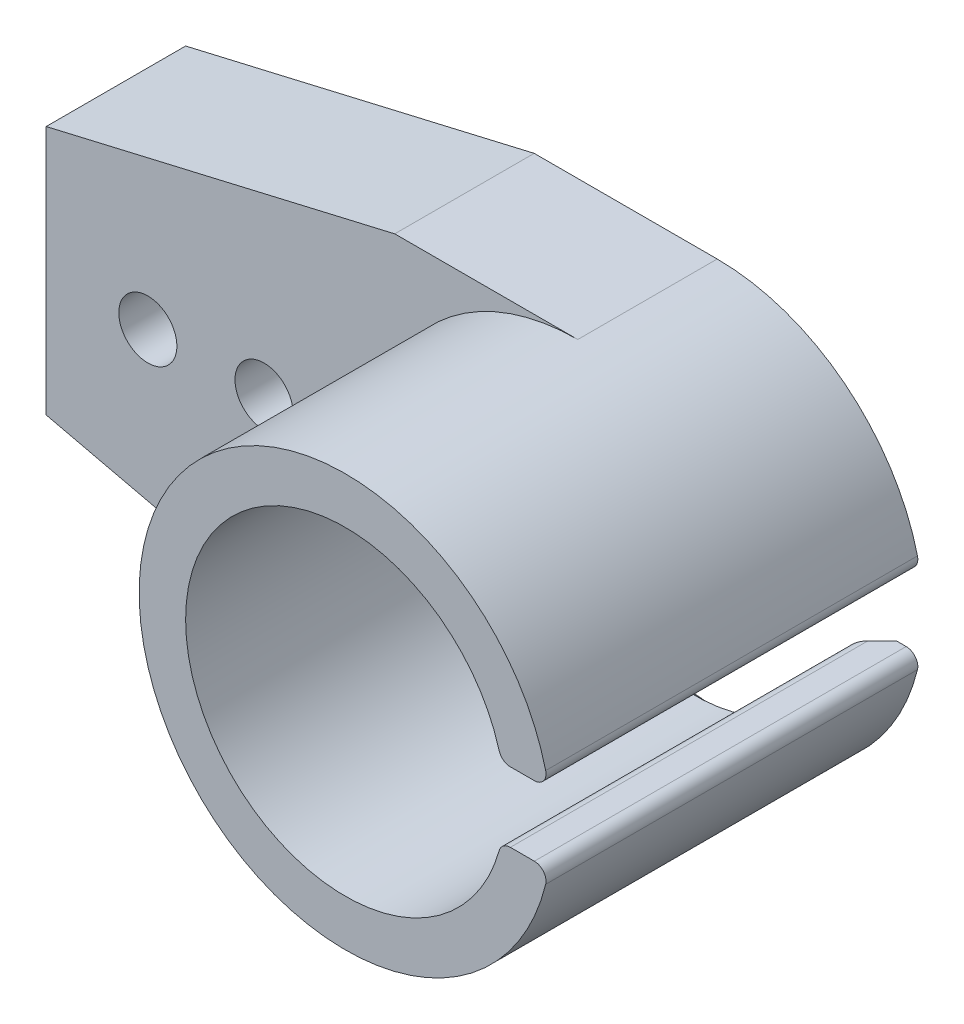
ISO-10303-21;
HEADER;
FILE_DESCRIPTION(('STEP AP214'),'2;1');
FILE_NAME('part.step','',(''),(''),'','','');
FILE_SCHEMA(('AUTOMOTIVE_DESIGN { 1 0 10303 214 1 1 1 1 }'));
ENDSEC;
DATA;
#1=APPLICATION_CONTEXT('core data for automotive mechanical design processes');
#2=APPLICATION_PROTOCOL_DEFINITION('international standard','automotive_design',2000,#1);
#3=PRODUCT_CONTEXT('',#1,'mechanical');
#4=PRODUCT('Part','Part','',(#3));
#5=PRODUCT_RELATED_PRODUCT_CATEGORY('part','',(#4));
#6=PRODUCT_DEFINITION_FORMATION('','',#4);
#7=PRODUCT_DEFINITION_CONTEXT('part definition',#1,'design');
#8=PRODUCT_DEFINITION('design','',#6,#7);
#9=PRODUCT_DEFINITION_SHAPE('','',#8);
#10=(LENGTH_UNIT() NAMED_UNIT(*) SI_UNIT(.MILLI.,.METRE.));
#11=(NAMED_UNIT(*) PLANE_ANGLE_UNIT() SI_UNIT($,.RADIAN.));
#12=(NAMED_UNIT(*) SI_UNIT($,.STERADIAN.) SOLID_ANGLE_UNIT());
#13=UNCERTAINTY_MEASURE_WITH_UNIT(LENGTH_MEASURE(1.E-05),#10,'distance_accuracy_value','');
#14=(GEOMETRIC_REPRESENTATION_CONTEXT(3) GLOBAL_UNCERTAINTY_ASSIGNED_CONTEXT((#13)) GLOBAL_UNIT_ASSIGNED_CONTEXT((#10,
#11,#12)) REPRESENTATION_CONTEXT('',''));
#15=CARTESIAN_POINT('',(0.,0.,0.));
#16=DIRECTION('',(0.,0.,1.));
#17=DIRECTION('',(1.,0.,0.));
#18=AXIS2_PLACEMENT_3D('',#15,#16,#17);
#19=CARTESIAN_POINT('',(-37.,0.,32.));
#20=DIRECTION('',(0.,0.,-1.));
#21=DIRECTION('',(-1.,0.,0.));
#22=AXIS2_PLACEMENT_3D('',#19,#20,#21);
#23=CYLINDRICAL_SURFACE('',#22,2.5);
#24=CARTESIAN_POINT('',(-37.,0.,2.));
#25=DIRECTION('',(0.,0.,-1.));
#26=DIRECTION('',(-1.,0.,0.));
#27=AXIS2_PLACEMENT_3D('',#24,#25,#26);
#28=CIRCLE('',#27,2.5);
#29=CARTESIAN_POINT('',(-39.5,0.,2.));
#30=VERTEX_POINT('',#29);
#31=EDGE_CURVE('E354',#30,#30,#28,.T.);
#32=ORIENTED_EDGE('',*,*,#31,.T.);
#33=EDGE_LOOP('',(#32));
#34=FACE_BOUND('',#33,.T.);
#35=CARTESIAN_POINT('',(-37.,0.,12.));
#36=DIRECTION('',(0.,0.,1.));
#37=DIRECTION('',(1.,0.,0.));
#38=AXIS2_PLACEMENT_3D('',#35,#36,#37);
#39=CIRCLE('',#38,2.5);
#40=CARTESIAN_POINT('',(-34.5,0.,12.));
#41=VERTEX_POINT('',#40);
#42=EDGE_CURVE('E394',#41,#41,#39,.T.);
#43=ORIENTED_EDGE('',*,*,#42,.T.);
#44=EDGE_LOOP('',(#43));
#45=FACE_BOUND('',#44,.T.);
#46=ADVANCED_FACE('F39',(#34,#45),#23,.F.);
#47=CARTESIAN_POINT('',(-27.,0.,32.));
#48=DIRECTION('',(0.,0.,-1.));
#49=DIRECTION('',(-1.,0.,0.));
#50=AXIS2_PLACEMENT_3D('',#47,#48,#49);
#51=CYLINDRICAL_SURFACE('',#50,2.5);
#52=CARTESIAN_POINT('',(-27.,0.,2.));
#53=DIRECTION('',(0.,0.,-1.));
#54=DIRECTION('',(-1.,0.,0.));
#55=AXIS2_PLACEMENT_3D('',#52,#53,#54);
#56=CIRCLE('',#55,2.5);
#57=CARTESIAN_POINT('',(-29.5,0.,2.));
#58=VERTEX_POINT('',#57);
#59=EDGE_CURVE('E44',#58,#58,#56,.T.);
#60=ORIENTED_EDGE('',*,*,#59,.T.);
#61=EDGE_LOOP('',(#60));
#62=FACE_BOUND('',#61,.T.);
#63=CARTESIAN_POINT('',(-27.,0.,12.));
#64=DIRECTION('',(0.,0.,1.));
#65=DIRECTION('',(1.,0.,0.));
#66=AXIS2_PLACEMENT_3D('',#63,#64,#65);
#67=CIRCLE('',#66,2.5);
#68=CARTESIAN_POINT('',(-24.5,0.,12.));
#69=VERTEX_POINT('',#68);
#70=EDGE_CURVE('E406',#69,#69,#67,.T.);
#71=ORIENTED_EDGE('',*,*,#70,.T.);
#72=EDGE_LOOP('',(#71));
#73=FACE_BOUND('',#72,.T.);
#74=ADVANCED_FACE('F251',(#62,#73),#51,.F.);
#75=CARTESIAN_POINT('',(-45.75,17.75,32.));
#76=DIRECTION('',(0.,-1.,0.));
#77=DIRECTION('',(0.,0.,-1.));
#78=AXIS2_PLACEMENT_3D('',#75,#76,#77);
#79=PLANE('',#78);
#80=DIRECTION('',(-1.,0.,0.));
#81=VECTOR('',#80,1.);
#82=CARTESIAN_POINT('',(-45.75,17.75,0.));
#83=LINE('',#82,#81);
#84=CARTESIAN_POINT('',(0.,17.75,0.));
#85=VERTEX_POINT('',#84);
#86=CARTESIAN_POINT('',(-15.75,17.75,0.));
#87=VERTEX_POINT('',#86);
#88=EDGE_CURVE('E200',#85,#87,#83,.T.);
#89=ORIENTED_EDGE('',*,*,#88,.T.);
#90=DIRECTION('',(0.,0.,1.));
#91=VECTOR('',#90,1.);
#92=CARTESIAN_POINT('',(-15.75,17.75,0.));
#93=LINE('',#92,#91);
#94=CARTESIAN_POINT('',(-15.75,17.75,12.));
#95=VERTEX_POINT('',#94);
#96=EDGE_CURVE('E172',#87,#95,#93,.T.);
#97=ORIENTED_EDGE('',*,*,#96,.T.);
#98=DIRECTION('',(-1.,0.,0.));
#99=VECTOR('',#98,1.);
#100=CARTESIAN_POINT('',(0.,17.75,12.));
#101=LINE('',#100,#99);
#102=CARTESIAN_POINT('',(0.,17.75,12.));
#103=VERTEX_POINT('',#102);
#104=EDGE_CURVE('E412',#103,#95,#101,.T.);
#105=ORIENTED_EDGE('',*,*,#104,.F.);
#106=DIRECTION('',(0.,0.,-1.));
#107=VECTOR('',#106,1.);
#108=CARTESIAN_POINT('',(0.,17.75,32.));
#109=LINE('',#108,#107);
#110=EDGE_CURVE('E212',#103,#85,#109,.T.);
#111=ORIENTED_EDGE('',*,*,#110,.T.);
#112=EDGE_LOOP('',(#89,#97,#105,#111));
#113=FACE_BOUND('',#112,.T.);
#114=ADVANCED_FACE('F240',(#113),#79,.F.);
#115=CARTESIAN_POINT('',(-45.75,-17.75,32.));
#116=DIRECTION('',(1.,0.,0.));
#117=DIRECTION('',(0.,0.,-1.));
#118=AXIS2_PLACEMENT_3D('',#115,#116,#117);
#119=PLANE('',#118);
#120=DIRECTION('',(0.,-1.,0.));
#121=VECTOR('',#120,1.);
#122=CARTESIAN_POINT('',(-45.75,17.75,12.));
#123=LINE('',#122,#121);
#124=CARTESIAN_POINT('',(-45.75,10.75,12.));
#125=VERTEX_POINT('',#124);
#126=CARTESIAN_POINT('',(-45.75,-10.75,12.));
#127=VERTEX_POINT('',#126);
#128=EDGE_CURVE('E187',#125,#127,#123,.T.);
#129=ORIENTED_EDGE('',*,*,#128,.F.);
#130=DIRECTION('',(0.,0.,1.));
#131=VECTOR('',#130,1.);
#132=CARTESIAN_POINT('',(-45.75,10.75,0.));
#133=LINE('',#132,#131);
#134=CARTESIAN_POINT('',(-45.75,10.75,0.));
#135=VERTEX_POINT('',#134);
#136=EDGE_CURVE('E64',#135,#125,#133,.T.);
#137=ORIENTED_EDGE('',*,*,#136,.F.);
#138=DIRECTION('',(0.,-1.,0.));
#139=VECTOR('',#138,1.);
#140=CARTESIAN_POINT('',(-45.75,-17.75,0.));
#141=LINE('',#140,#139);
#142=CARTESIAN_POINT('',(-45.75,10.1,0.));
#143=VERTEX_POINT('',#142);
#144=EDGE_CURVE('E183',#135,#143,#141,.T.);
#145=ORIENTED_EDGE('',*,*,#144,.T.);
#146=DIRECTION('',(0.,0.,-1.));
#147=VECTOR('',#146,1.);
#148=CARTESIAN_POINT('',(-45.75,10.1,2.));
#149=LINE('',#148,#147);
#150=CARTESIAN_POINT('',(-45.75,10.1,2.));
#151=VERTEX_POINT('',#150);
#152=EDGE_CURVE('E377',#151,#143,#149,.T.);
#153=ORIENTED_EDGE('',*,*,#152,.F.);
#154=DIRECTION('',(0.,1.,0.));
#155=VECTOR('',#154,1.);
#156=CARTESIAN_POINT('',(-45.75,-10.1,2.));
#157=LINE('',#156,#155);
#158=CARTESIAN_POINT('',(-45.75,-10.1,2.));
#159=VERTEX_POINT('',#158);
#160=EDGE_CURVE('E389',#159,#151,#157,.T.);
#161=ORIENTED_EDGE('',*,*,#160,.F.);
#162=DIRECTION('',(0.,0.,-1.));
#163=VECTOR('',#162,1.);
#164=CARTESIAN_POINT('',(-45.75,-10.1,2.));
#165=LINE('',#164,#163);
#166=CARTESIAN_POINT('',(-45.75,-10.1,0.));
#167=VERTEX_POINT('',#166);
#168=EDGE_CURVE('E384',#159,#167,#165,.T.);
#169=ORIENTED_EDGE('',*,*,#168,.T.);
#170=CARTESIAN_POINT('',(-45.75,-10.75,0.));
#171=VERTEX_POINT('',#170);
#172=EDGE_CURVE('E195',#167,#171,#141,.T.);
#173=ORIENTED_EDGE('',*,*,#172,.T.);
#174=DIRECTION('',(0.,0.,1.));
#175=VECTOR('',#174,1.);
#176=CARTESIAN_POINT('',(-45.75,-10.75,0.));
#177=LINE('',#176,#175);
#178=EDGE_CURVE('E421',#171,#127,#177,.T.);
#179=ORIENTED_EDGE('',*,*,#178,.T.);
#180=EDGE_LOOP('',(#129,#137,#145,#153,#161,#169,#173,#179));
#181=FACE_BOUND('',#180,.T.);
#182=ADVANCED_FACE('F181',(#181),#119,.F.);
#183=CARTESIAN_POINT('',(0.,-17.75,32.));
#184=DIRECTION('',(0.,1.,0.));
#185=DIRECTION('',(0.,0.,1.));
#186=AXIS2_PLACEMENT_3D('',#183,#184,#185);
#187=PLANE('',#186);
#188=DIRECTION('',(1.,0.,0.));
#189=VECTOR('',#188,1.);
#190=CARTESIAN_POINT('',(-45.75,-17.75,12.));
#191=LINE('',#190,#189);
#192=CARTESIAN_POINT('',(-15.75,-17.75,12.));
#193=VERTEX_POINT('',#192);
#194=CARTESIAN_POINT('',(0.,-17.75,12.));
#195=VERTEX_POINT('',#194);
#196=EDGE_CURVE('E409',#193,#195,#191,.T.);
#197=ORIENTED_EDGE('',*,*,#196,.F.);
#198=DIRECTION('',(0.,0.,1.));
#199=VECTOR('',#198,1.);
#200=CARTESIAN_POINT('',(-15.75,-17.75,0.));
#201=LINE('',#200,#199);
#202=CARTESIAN_POINT('',(-15.75,-17.75,0.));
#203=VERTEX_POINT('',#202);
#204=EDGE_CURVE('E56',#203,#193,#201,.T.);
#205=ORIENTED_EDGE('',*,*,#204,.F.);
#206=DIRECTION('',(1.,0.,0.));
#207=VECTOR('',#206,1.);
#208=CARTESIAN_POINT('',(0.,-17.75,0.));
#209=LINE('',#208,#207);
#210=CARTESIAN_POINT('',(0.,-17.75,0.));
#211=VERTEX_POINT('',#210);
#212=EDGE_CURVE('E194',#203,#211,#209,.T.);
#213=ORIENTED_EDGE('',*,*,#212,.T.);
#214=DIRECTION('',(0.,0.,-1.));
#215=VECTOR('',#214,1.);
#216=CARTESIAN_POINT('',(0.,-17.75,32.));
#217=LINE('',#216,#215);
#218=EDGE_CURVE('E209',#195,#211,#217,.T.);
#219=ORIENTED_EDGE('',*,*,#218,.F.);
#220=EDGE_LOOP('',(#197,#205,#213,#219));
#221=FACE_BOUND('',#220,.T.);
#222=ADVANCED_FACE('F264',(#221),#187,.F.);
#223=CARTESIAN_POINT('',(0.,0.,32.));
#224=DIRECTION('',(0.,0.,1.));
#225=DIRECTION('',(1.,0.,0.));
#226=AXIS2_PLACEMENT_3D('',#223,#224,#225);
#227=PLANE('',#226);
#228=CARTESIAN_POINT('',(16.2653773396131,4.,32.));
#229=DIRECTION('',(0.,0.,1.));
#230=DIRECTION('',(1.,0.,0.));
#231=AXIS2_PLACEMENT_3D('',#228,#229,#230);
#232=CIRCLE('',#231,1.);
#233=CARTESIAN_POINT('',(16.2653773396131,3.,32.));
#234=VERTEX_POINT('',#233);
#235=CARTESIAN_POINT('',(17.2364446434706,4.23880597014925,32.));
#236=VERTEX_POINT('',#235);
#237=EDGE_CURVE('E295',#234,#236,#232,.T.);
#238=ORIENTED_EDGE('',*,*,#237,.T.);
#239=CARTESIAN_POINT('',(0.,0.,32.));
#240=DIRECTION('',(0.,0.,1.));
#241=DIRECTION('',(-1.,0.,0.));
#242=AXIS2_PLACEMENT_3D('',#239,#240,#241);
#243=CIRCLE('',#242,17.75);
#244=CARTESIAN_POINT('',(17.2364446434706,-4.23880597014925,32.));
#245=VERTEX_POINT('',#244);
#246=EDGE_CURVE('E343',#236,#245,#243,.T.);
#247=ORIENTED_EDGE('',*,*,#246,.T.);
#248=CARTESIAN_POINT('',(16.2653773396131,-4.,32.));
#249=DIRECTION('',(0.,0.,1.));
#250=DIRECTION('',(1.,0.,0.));
#251=AXIS2_PLACEMENT_3D('',#248,#249,#250);
#252=CIRCLE('',#251,1.);
#253=CARTESIAN_POINT('',(16.2653773396131,-3.,32.));
#254=VERTEX_POINT('',#253);
#255=EDGE_CURVE('E298',#245,#254,#252,.T.);
#256=ORIENTED_EDGE('',*,*,#255,.T.);
#257=DIRECTION('',(-1.,0.,0.));
#258=VECTOR('',#257,1.);
#259=CARTESIAN_POINT('',(17.4946420369209,-3.,32.));
#260=LINE('',#259,#258);
#261=CARTESIAN_POINT('',(14.1972708645007,-3.,32.));
#262=VERTEX_POINT('',#261);
#263=EDGE_CURVE('E213',#254,#262,#260,.T.);
#264=ORIENTED_EDGE('',*,*,#263,.T.);
#265=CARTESIAN_POINT('',(14.1972708645007,-4.,32.));
#266=DIRECTION('',(0.,0.,1.));
#267=DIRECTION('',(1.,0.,0.));
#268=AXIS2_PLACEMENT_3D('',#265,#266,#267);
#269=CIRCLE('',#268,1.);
#270=CARTESIAN_POINT('',(13.2347440262295,-3.72881355932203,32.));
#271=VERTEX_POINT('',#270);
#272=EDGE_CURVE('E293',#262,#271,#269,.T.);
#273=ORIENTED_EDGE('',*,*,#272,.T.);
#274=CARTESIAN_POINT('',(0.,0.,32.));
#275=DIRECTION('',(0.,0.,-1.));
#276=DIRECTION('',(1.,0.,0.));
#277=AXIS2_PLACEMENT_3D('',#274,#275,#276);
#278=CIRCLE('',#277,13.75);
#279=CARTESIAN_POINT('',(13.2347440262295,3.72881355932203,32.));
#280=VERTEX_POINT('',#279);
#281=EDGE_CURVE('E208',#271,#280,#278,.T.);
#282=ORIENTED_EDGE('',*,*,#281,.T.);
#283=CARTESIAN_POINT('',(14.1972708645007,4.,32.));
#284=DIRECTION('',(0.,0.,1.));
#285=DIRECTION('',(1.,0.,0.));
#286=AXIS2_PLACEMENT_3D('',#283,#284,#285);
#287=CIRCLE('',#286,1.);
#288=CARTESIAN_POINT('',(14.1972708645007,3.,32.));
#289=VERTEX_POINT('',#288);
#290=EDGE_CURVE('E291',#280,#289,#287,.T.);
#291=ORIENTED_EDGE('',*,*,#290,.T.);
#292=DIRECTION('',(1.,0.,0.));
#293=VECTOR('',#292,1.);
#294=CARTESIAN_POINT('',(13.4187369003196,3.,32.));
#295=LINE('',#294,#293);
#296=EDGE_CURVE('E347',#289,#234,#295,.T.);
#297=ORIENTED_EDGE('',*,*,#296,.T.);
#298=EDGE_LOOP('',(#238,#247,#256,#264,#273,#282,#291,#297));
#299=FACE_BOUND('',#298,.T.);
#300=ADVANCED_FACE('F247',(#299),#227,.T.);
#301=CARTESIAN_POINT('',(0.,0.,0.));
#302=DIRECTION('',(0.,0.,1.));
#303=DIRECTION('',(1.,0.,0.));
#304=AXIS2_PLACEMENT_3D('',#301,#302,#303);
#305=PLANE('',#304);
#306=ORIENTED_EDGE('',*,*,#144,.F.);
#307=DIRECTION('',(0.973841209741793,0.227229615606419,0.));
#308=VECTOR('',#307,1.);
#309=CARTESIAN_POINT('',(-15.75,17.75,0.));
#310=LINE('',#309,#308);
#311=EDGE_CURVE('E169',#135,#87,#310,.T.);
#312=ORIENTED_EDGE('',*,*,#311,.T.);
#313=ORIENTED_EDGE('',*,*,#88,.F.);
#314=CARTESIAN_POINT('',(0.,0.,0.));
#315=DIRECTION('',(0.,0.,1.));
#316=DIRECTION('',(1.,0.,0.));
#317=AXIS2_PLACEMENT_3D('',#314,#315,#316);
#318=CIRCLE('',#317,17.75);
#319=CARTESIAN_POINT('',(17.2364446434706,4.23880597014925,0.));
#320=VERTEX_POINT('',#319);
#321=EDGE_CURVE('E353',#320,#85,#318,.T.);
#322=ORIENTED_EDGE('',*,*,#321,.F.);
#323=CARTESIAN_POINT('',(16.2653773396131,4.,0.));
#324=DIRECTION('',(0.,0.,1.));
#325=DIRECTION('',(1.,0.,0.));
#326=AXIS2_PLACEMENT_3D('',#323,#324,#325);
#327=CIRCLE('',#326,1.);
#328=CARTESIAN_POINT('',(16.2653773396131,3.,0.));
#329=VERTEX_POINT('',#328);
#330=EDGE_CURVE('E285',#320,#329,#327,.F.);
#331=ORIENTED_EDGE('',*,*,#330,.T.);
#332=DIRECTION('',(1.,0.,0.));
#333=VECTOR('',#332,1.);
#334=CARTESIAN_POINT('',(13.4187369003196,3.,0.));
#335=LINE('',#334,#333);
#336=CARTESIAN_POINT('',(15.4616460960662,3.,0.));
#337=VERTEX_POINT('',#336);
#338=EDGE_CURVE('E351',#337,#329,#335,.T.);
#339=ORIENTED_EDGE('',*,*,#338,.F.);
#340=CARTESIAN_POINT('',(0.,0.,0.));
#341=DIRECTION('',(0.,0.,1.));
#342=DIRECTION('',(1.,0.,0.));
#343=AXIS2_PLACEMENT_3D('',#340,#341,#342);
#344=CIRCLE('',#343,15.75);
#345=CARTESIAN_POINT('',(15.4616460960662,-3.,0.));
#346=VERTEX_POINT('',#345);
#347=EDGE_CURVE('E226',#337,#346,#344,.T.);
#348=ORIENTED_EDGE('',*,*,#347,.T.);
#349=DIRECTION('',(-1.,0.,0.));
#350=VECTOR('',#349,1.);
#351=CARTESIAN_POINT('',(17.4946420369209,-3.,0.));
#352=LINE('',#351,#350);
#353=CARTESIAN_POINT('',(16.2653773396131,-3.,0.));
#354=VERTEX_POINT('',#353);
#355=EDGE_CURVE('E206',#354,#346,#352,.T.);
#356=ORIENTED_EDGE('',*,*,#355,.F.);
#357=CARTESIAN_POINT('',(16.2653773396131,-4.,0.));
#358=DIRECTION('',(0.,0.,1.));
#359=DIRECTION('',(1.,0.,0.));
#360=AXIS2_PLACEMENT_3D('',#357,#358,#359);
#361=CIRCLE('',#360,1.);
#362=CARTESIAN_POINT('',(17.2364446434706,-4.23880597014925,0.));
#363=VERTEX_POINT('',#362);
#364=EDGE_CURVE('E287',#354,#363,#361,.F.);
#365=ORIENTED_EDGE('',*,*,#364,.T.);
#366=CARTESIAN_POINT('',(0.,0.,0.));
#367=DIRECTION('',(0.,0.,1.));
#368=DIRECTION('',(-1.,0.,0.));
#369=AXIS2_PLACEMENT_3D('',#366,#367,#368);
#370=CIRCLE('',#369,17.75);
#371=EDGE_CURVE('E197',#211,#363,#370,.T.);
#372=ORIENTED_EDGE('',*,*,#371,.F.);
#373=ORIENTED_EDGE('',*,*,#212,.F.);
#374=DIRECTION('',(-0.973841209741793,0.227229615606419,0.));
#375=VECTOR('',#374,1.);
#376=CARTESIAN_POINT('',(-15.75,-17.75,0.));
#377=LINE('',#376,#375);
#378=EDGE_CURVE('E416',#203,#171,#377,.T.);
#379=ORIENTED_EDGE('',*,*,#378,.T.);
#380=ORIENTED_EDGE('',*,*,#172,.F.);
#381=DIRECTION('',(-1.,0.,0.));
#382=VECTOR('',#381,1.);
#383=CARTESIAN_POINT('',(-27.,-10.1,0.));
#384=LINE('',#383,#382);
#385=CARTESIAN_POINT('',(-27.,-10.1,0.));
#386=VERTEX_POINT('',#385);
#387=EDGE_CURVE('E387',#386,#167,#384,.T.);
#388=ORIENTED_EDGE('',*,*,#387,.F.);
#389=CARTESIAN_POINT('',(-27.,0.,0.));
#390=DIRECTION('',(0.,0.,-1.));
#391=DIRECTION('',(-1.,0.,0.));
#392=AXIS2_PLACEMENT_3D('',#389,#390,#391);
#393=CIRCLE('',#392,10.1);
#394=CARTESIAN_POINT('',(-27.,10.1,0.));
#395=VERTEX_POINT('',#394);
#396=EDGE_CURVE('E390',#395,#386,#393,.T.);
#397=ORIENTED_EDGE('',*,*,#396,.F.);
#398=DIRECTION('',(1.,0.,0.));
#399=VECTOR('',#398,1.);
#400=CARTESIAN_POINT('',(-45.75,10.1,0.));
#401=LINE('',#400,#399);
#402=EDGE_CURVE('E193',#143,#395,#401,.T.);
#403=ORIENTED_EDGE('',*,*,#402,.F.);
#404=EDGE_LOOP('',(#306,#312,#313,#322,#331,#339,#348,#356,#365,#372,#373,#379,#380,#388,#397,#403));
#405=FACE_BOUND('',#404,.T.);
#406=ADVANCED_FACE('F190',(#405),#305,.F.);
#407=CARTESIAN_POINT('',(0.,0.,32.));
#408=DIRECTION('',(0.,0.,-1.));
#409=DIRECTION('',(-1.,0.,0.));
#410=AXIS2_PLACEMENT_3D('',#407,#408,#409);
#411=CYLINDRICAL_SURFACE('',#410,13.75);
#412=ORIENTED_EDGE('',*,*,#281,.F.);
#413=DIRECTION('',(0.,0.,-1.));
#414=VECTOR('',#413,1.);
#415=CARTESIAN_POINT('',(13.2347440262294,-3.72881355932203,32.));
#416=LINE('',#415,#414);
#417=CARTESIAN_POINT('',(13.2347440262295,-3.72881355932203,2.00000000000001));
#418=VERTEX_POINT('',#417);
#419=EDGE_CURVE('E310',#271,#418,#416,.T.);
#420=ORIENTED_EDGE('',*,*,#419,.T.);
#421=CARTESIAN_POINT('',(0.,0.,2.00000000000001));
#422=DIRECTION('',(0.,0.,1.));
#423=DIRECTION('',(1.,0.,0.));
#424=AXIS2_PLACEMENT_3D('',#421,#422,#423);
#425=CIRCLE('',#424,13.75);
#426=CARTESIAN_POINT('',(13.2347440262295,3.72881355932203,2.00000000000001));
#427=VERTEX_POINT('',#426);
#428=EDGE_CURVE('E215',#418,#427,#425,.F.);
#429=ORIENTED_EDGE('',*,*,#428,.T.);
#430=DIRECTION('',(0.,0.,-1.));
#431=VECTOR('',#430,1.);
#432=CARTESIAN_POINT('',(13.2347440262294,3.72881355932203,32.));
#433=LINE('',#432,#431);
#434=EDGE_CURVE('E308',#427,#280,#433,.F.);
#435=ORIENTED_EDGE('',*,*,#434,.T.);
#436=EDGE_LOOP('',(#412,#420,#429,#435));
#437=FACE_BOUND('',#436,.T.);
#438=ADVANCED_FACE('F238',(#437),#411,.F.);
#439=CARTESIAN_POINT('',(13.4187369003196,3.,32.));
#440=DIRECTION('',(0.,1.,0.));
#441=DIRECTION('',(0.,0.,1.));
#442=AXIS2_PLACEMENT_3D('',#439,#440,#441);
#443=PLANE('',#442);
#444=ORIENTED_EDGE('',*,*,#338,.T.);
#445=DIRECTION('',(0.,0.,-1.));
#446=VECTOR('',#445,1.);
#447=CARTESIAN_POINT('',(16.2653773396131,3.,32.));
#448=LINE('',#447,#446);
#449=EDGE_CURVE('E306',#329,#234,#448,.F.);
#450=ORIENTED_EDGE('',*,*,#449,.T.);
#451=ORIENTED_EDGE('',*,*,#296,.F.);
#452=DIRECTION('',(0.,0.,-1.));
#453=VECTOR('',#452,1.);
#454=CARTESIAN_POINT('',(14.1972708645007,3.,32.));
#455=LINE('',#454,#453);
#456=CARTESIAN_POINT('',(14.1972708645007,3.,1.23922813906856));
#457=VERTEX_POINT('',#456);
#458=EDGE_CURVE('E303',#289,#457,#455,.T.);
#459=ORIENTED_EDGE('',*,*,#458,.T.);
#460=CARTESIAN_POINT('',(13.4187369003196,3.,2.00000000000001));
#461=CARTESIAN_POINT('',(13.5892420785567,3.,1.83360189063176));
#462=CARTESIAN_POINT('',(13.7596725050172,3.,1.66712721006761));
#463=CARTESIAN_POINT('',(14.1003977059202,3.,1.334039267167));
#464=CARTESIAN_POINT('',(14.2706924804361,3.,1.16742600490561));
#465=CARTESIAN_POINT('',(14.6111603962887,3.,0.834075295950691));
#466=CARTESIAN_POINT('',(14.7813335376378,3.,0.667337849269745));
#467=CARTESIAN_POINT('',(15.1215696396514,3.,0.333750392598996));
#468=CARTESIAN_POINT('',(15.2916326002563,3.,0.166900382548354));
#469=CARTESIAN_POINT('',(15.4616460960662,3.,0.));
#470=B_SPLINE_CURVE_WITH_KNOTS('',3,(#460,#461,#462,#463,#464,#465,#466,#467,#468,#469),
.UNSPECIFIED.,.F.,.F.,(4,2,2,2,4),(0.,0.71473285100271,1.42946531515945,2.14419770694696,
2.85893048534195),.UNSPECIFIED.);
#471=EDGE_CURVE('E218',#457,#337,#470,.T.);
#472=ORIENTED_EDGE('',*,*,#471,.T.);
#473=EDGE_LOOP('',(#444,#450,#451,#459,#472));
#474=FACE_BOUND('',#473,.T.);
#475=ADVANCED_FACE('F233',(#474),#443,.F.);
#476=CARTESIAN_POINT('',(0.,0.,32.));
#477=DIRECTION('',(0.,0.,-1.));
#478=DIRECTION('',(-1.,0.,0.));
#479=AXIS2_PLACEMENT_3D('',#476,#477,#478);
#480=CYLINDRICAL_SURFACE('',#479,17.75);
#481=ORIENTED_EDGE('',*,*,#371,.T.);
#482=DIRECTION('',(0.,0.,-1.));
#483=VECTOR('',#482,1.);
#484=CARTESIAN_POINT('',(17.2364446434706,-4.23880597014925,32.));
#485=LINE('',#484,#483);
#486=EDGE_CURVE('E289',#363,#245,#485,.F.);
#487=ORIENTED_EDGE('',*,*,#486,.T.);
#488=ORIENTED_EDGE('',*,*,#246,.F.);
#489=DIRECTION('',(0.,0.,-1.));
#490=VECTOR('',#489,1.);
#491=CARTESIAN_POINT('',(17.2364446434706,4.23880597014925,32.));
#492=LINE('',#491,#490);
#493=EDGE_CURVE('E300',#236,#320,#492,.T.);
#494=ORIENTED_EDGE('',*,*,#493,.T.);
#495=ORIENTED_EDGE('',*,*,#321,.T.);
#496=ORIENTED_EDGE('',*,*,#110,.F.);
#497=CARTESIAN_POINT('',(0.,0.,12.));
#498=DIRECTION('',(0.,0.,-1.));
#499=DIRECTION('',(1.,0.,0.));
#500=AXIS2_PLACEMENT_3D('',#497,#498,#499);
#501=CIRCLE('',#500,17.75);
#502=EDGE_CURVE('E414',#195,#103,#501,.T.);
#503=ORIENTED_EDGE('',*,*,#502,.F.);
#504=ORIENTED_EDGE('',*,*,#218,.T.);
#505=EDGE_LOOP('',(#481,#487,#488,#494,#495,#496,#503,#504));
#506=FACE_BOUND('',#505,.T.);
#507=ADVANCED_FACE('F237',(#506),#480,.T.);
#508=CARTESIAN_POINT('',(17.4946420369209,-3.,32.));
#509=DIRECTION('',(0.,-1.,0.));
#510=DIRECTION('',(0.,0.,-1.));
#511=AXIS2_PLACEMENT_3D('',#508,#509,#510);
#512=PLANE('',#511);
#513=ORIENTED_EDGE('',*,*,#263,.F.);
#514=DIRECTION('',(0.,0.,-1.));
#515=VECTOR('',#514,1.);
#516=CARTESIAN_POINT('',(16.2653773396131,-3.,32.));
#517=LINE('',#516,#515);
#518=EDGE_CURVE('E282',#254,#354,#517,.T.);
#519=ORIENTED_EDGE('',*,*,#518,.T.);
#520=ORIENTED_EDGE('',*,*,#355,.T.);
#521=CARTESIAN_POINT('',(15.4616460960662,-3.,0.));
#522=CARTESIAN_POINT('',(15.2916326002563,-3.,0.166900382548354));
#523=CARTESIAN_POINT('',(15.1215696396514,-3.,0.333750392598996));
#524=CARTESIAN_POINT('',(14.7813335376378,-3.,0.667337849269745));
#525=CARTESIAN_POINT('',(14.6111603962887,-3.,0.834075295950691));
#526=CARTESIAN_POINT('',(14.2706924804361,-3.,1.16742600490561));
#527=CARTESIAN_POINT('',(14.1003977059202,-3.,1.334039267167));
#528=CARTESIAN_POINT('',(13.7596725050172,-3.,1.66712721006761));
#529=CARTESIAN_POINT('',(13.5892420785567,-3.,1.83360189063176));
#530=CARTESIAN_POINT('',(13.4187369003196,-3.,2.00000000000001));
#531=B_SPLINE_CURVE_WITH_KNOTS('',3,(#521,#522,#523,#524,#525,#526,#527,#528,#529,#530),
.UNSPECIFIED.,.F.,.F.,(4,2,2,2,4),(0.,0.71473277839499,1.4294651701825,2.14419763433924,
2.85893048534195),.UNSPECIFIED.);
#532=CARTESIAN_POINT('',(14.1972708644937,-3.,1.23922813907536));
#533=VERTEX_POINT('',#532);
#534=EDGE_CURVE('E273',#346,#533,#531,.T.);
#535=ORIENTED_EDGE('',*,*,#534,.T.);
#536=DIRECTION('',(0.,0.,-1.));
#537=VECTOR('',#536,1.);
#538=CARTESIAN_POINT('',(14.1972708645007,-3.,32.));
#539=LINE('',#538,#537);
#540=EDGE_CURVE('E280',#533,#262,#539,.F.);
#541=ORIENTED_EDGE('',*,*,#540,.T.);
#542=EDGE_LOOP('',(#513,#519,#520,#535,#541));
#543=FACE_BOUND('',#542,.T.);
#544=ADVANCED_FACE('F267',(#543),#512,.F.);
#545=CARTESIAN_POINT('',(0.,0.,2.00000000000001));
#546=DIRECTION('',(0.,0.,-1.));
#547=DIRECTION('',(-1.,0.,0.));
#548=AXIS2_PLACEMENT_3D('',#545,#546,#547);
#549=CONICAL_SURFACE('',#548,13.75,0.785398163397451);
#550=ORIENTED_EDGE('',*,*,#428,.F.);
#551=CARTESIAN_POINT('',(13.2347440262294,-3.72881355932203,2.00000000000001));
#552=CARTESIAN_POINT('',(13.2407218478135,-3.70758422137118,2.00000375862322));
#553=CARTESIAN_POINT('',(13.2474050525263,-3.68656844436341,1.99921659631819));
#554=CARTESIAN_POINT('',(13.2620931631392,-3.64514198138205,1.99610246736423));
#555=CARTESIAN_POINT('',(13.2700968602509,-3.62473076196382,1.99377690317357));
#556=CARTESIAN_POINT('',(13.2957961877761,-3.56502520968158,1.98461661363989));
#557=CARTESIAN_POINT('',(13.3153066232022,-3.52681616397324,1.975596354715));
#558=CARTESIAN_POINT('',(13.3581043099884,-3.45450392719685,1.95250343736967));
#559=CARTESIAN_POINT('',(13.3813791167295,-3.42038783137422,1.93844724724139));
#560=CARTESIAN_POINT('',(13.4308315755221,-3.35640797244032,1.90618069665913));
#561=CARTESIAN_POINT('',(13.4570163026198,-3.32655499530481,1.88796009226797));
#562=CARTESIAN_POINT('',(13.523687340632,-3.2587477550591,1.83931317661132));
#563=CARTESIAN_POINT('',(13.5653032078565,-3.22320073161143,1.80708566741417));
#564=CARTESIAN_POINT('',(13.6510081406003,-3.16070112094753,1.73791824541442));
#565=CARTESIAN_POINT('',(13.695102879073,-3.13376927641641,1.70096725460818));
#566=CARTESIAN_POINT('',(13.8031441603516,-3.07818876110092,1.60786707451446));
#567=CARTESIAN_POINT('',(13.8677281854394,-3.05347431949433,1.55011917630009));
#568=CARTESIAN_POINT('',(13.9972444481731,-3.01791048370766,1.43114289153325));
#569=CARTESIAN_POINT('',(14.0621764736322,-3.00705343384205,1.36991644629339));
#570=CARTESIAN_POINT('',(14.1502484807245,-3.00082895368694,1.28506017278552));
#571=CARTESIAN_POINT('',(14.1738090131221,-3.00000619472011,1.26218051368827));
#572=CARTESIAN_POINT('',(14.1972708644938,-2.99999999999999,1.23922813907531));
#573=B_SPLINE_CURVE_WITH_KNOTS('',3,(#551,#552,#553,#554,#555,#556,#557,#558,#559,#560,#561,
#562,#563,#564,#565,#566,#567,#568,#569,#570,#571,#572),.UNSPECIFIED.,.F.,.F.,(4,2,2,2,2,2,2,2,
2,2,4),(0.,0.0661117193894121,0.132163252043153,0.26290712583797,0.393227291587912,
0.523871546216423,0.713358523418416,0.903298351456973,1.17214025242453,1.44083356401623,
1.53933593787811),.UNSPECIFIED.);
#574=EDGE_CURVE('E11',#418,#533,#573,.T.);
#575=ORIENTED_EDGE('',*,*,#574,.T.);
#576=ORIENTED_EDGE('',*,*,#534,.F.);
#577=ORIENTED_EDGE('',*,*,#347,.F.);
#578=ORIENTED_EDGE('',*,*,#471,.F.);
#579=CARTESIAN_POINT('',(14.1972708645007,3.,1.23922813906856));
#580=CARTESIAN_POINT('',(14.1672596244913,3.00000630187263,1.2685890648168));
#581=CARTESIAN_POINT('',(14.1371193148195,3.00135110223293,1.29779696419718));
#582=CARTESIAN_POINT('',(14.076639815093,3.00683624080135,1.35580777784304));
#583=CARTESIAN_POINT('',(14.046300438517,3.0109797420731,1.38461019619751));
#584=CARTESIAN_POINT('',(13.954630440369,3.02788262386854,1.47067262034056));
#585=CARTESIAN_POINT('',(13.8931903794703,3.04511894927495,1.52705555438693));
#586=CARTESIAN_POINT('',(13.7848407928433,3.08757966448139,1.62363522272018));
#587=CARTESIAN_POINT('',(13.7376819405989,3.11024547511269,1.66468206573317));
#588=CARTESIAN_POINT('',(13.645244392566,3.16446198380739,1.74267462192124));
#589=CARTESIAN_POINT('',(13.5999600205521,3.19598319971382,1.77963338586778));
#590=CARTESIAN_POINT('',(13.5233393112415,3.2599535364204,1.83932715979955));
#591=CARTESIAN_POINT('',(13.4912790794006,3.29033311969572,1.86334009690612));
#592=CARTESIAN_POINT('',(13.430143014345,3.35692205805531,1.90673078427127));
#593=CARTESIAN_POINT('',(13.4010644893441,3.39312607779589,1.92611273663907));
#594=CARTESIAN_POINT('',(13.352284499998,3.46382388011514,1.9557885532171));
#595=CARTESIAN_POINT('',(13.3318455205079,3.49737824762865,1.9671030586662));
#596=CARTESIAN_POINT('',(13.2947001818849,3.56764042032953,1.98498550029203));
#597=CARTESIAN_POINT('',(13.2779856471801,3.60434106868679,1.99156390504791));
#598=CARTESIAN_POINT('',(13.258066497655,3.65630246906703,1.99701328332334));
#599=CARTESIAN_POINT('',(13.2529444064734,3.67063653840069,1.99813191309446));
#600=CARTESIAN_POINT('',(13.2433516989838,3.69955114559926,1.99962501829847));
#601=CARTESIAN_POINT('',(13.2388807586923,3.71413155683743,1.99999986498458));
#602=CARTESIAN_POINT('',(13.2347440262294,3.72881355932203,2.00000000000001));
#603=B_SPLINE_CURVE_WITH_KNOTS('',3,(#579,#580,#581,#582,#583,#584,#585,#586,#587,#588,#589,
#590,#591,#592,#593,#594,#595,#596,#597,#598,#599,#600,#601,#602),.UNSPECIFIED.,.F.,.F.,(4,2,2,
2,2,2,2,2,2,2,2,4),(0.,0.12589921535764,0.251940959359116,0.506285925644895,0.705215816837913,
0.90349110669147,1.05379632251984,1.20396463050045,1.32613779426145,1.4480400728847,
1.49380121120138,1.53953950246931),.UNSPECIFIED.);
#604=EDGE_CURVE('E49',#457,#427,#603,.T.);
#605=ORIENTED_EDGE('',*,*,#604,.T.);
#606=EDGE_LOOP('',(#550,#575,#576,#577,#578,#605));
#607=FACE_BOUND('',#606,.T.);
#608=ADVANCED_FACE('F229',(#607),#549,.F.);
#609=CARTESIAN_POINT('',(16.2653773396131,-4.,32.));
#610=DIRECTION('',(0.,0.,-1.));
#611=DIRECTION('',(-1.,0.,0.));
#612=AXIS2_PLACEMENT_3D('',#609,#610,#611);
#613=CYLINDRICAL_SURFACE('',#612,1.);
#614=ORIENTED_EDGE('',*,*,#255,.F.);
#615=ORIENTED_EDGE('',*,*,#486,.F.);
#616=ORIENTED_EDGE('',*,*,#364,.F.);
#617=ORIENTED_EDGE('',*,*,#518,.F.);
#618=EDGE_LOOP('',(#614,#615,#616,#617));
#619=FACE_BOUND('',#618,.T.);
#620=ADVANCED_FACE('F328',(#619),#613,.T.);
#621=CARTESIAN_POINT('',(16.2653773396131,4.,32.));
#622=DIRECTION('',(0.,0.,-1.));
#623=DIRECTION('',(-1.,0.,0.));
#624=AXIS2_PLACEMENT_3D('',#621,#622,#623);
#625=CYLINDRICAL_SURFACE('',#624,1.);
#626=ORIENTED_EDGE('',*,*,#237,.F.);
#627=ORIENTED_EDGE('',*,*,#449,.F.);
#628=ORIENTED_EDGE('',*,*,#330,.F.);
#629=ORIENTED_EDGE('',*,*,#493,.F.);
#630=EDGE_LOOP('',(#626,#627,#628,#629));
#631=FACE_BOUND('',#630,.T.);
#632=ADVANCED_FACE('F325',(#631),#625,.T.);
#633=CARTESIAN_POINT('',(14.1972708645007,-4.,32.));
#634=DIRECTION('',(0.,0.,-1.));
#635=DIRECTION('',(-1.,0.,0.));
#636=AXIS2_PLACEMENT_3D('',#633,#634,#635);
#637=CYLINDRICAL_SURFACE('',#636,1.);
#638=ORIENTED_EDGE('',*,*,#272,.F.);
#639=ORIENTED_EDGE('',*,*,#540,.F.);
#640=ORIENTED_EDGE('',*,*,#574,.F.);
#641=ORIENTED_EDGE('',*,*,#419,.F.);
#642=EDGE_LOOP('',(#638,#639,#640,#641));
#643=FACE_BOUND('',#642,.T.);
#644=ADVANCED_FACE('F321',(#643),#637,.T.);
#645=CARTESIAN_POINT('',(14.1972708645007,4.,32.));
#646=DIRECTION('',(0.,0.,-1.));
#647=DIRECTION('',(-1.,0.,0.));
#648=AXIS2_PLACEMENT_3D('',#645,#646,#647);
#649=CYLINDRICAL_SURFACE('',#648,1.);
#650=ORIENTED_EDGE('',*,*,#290,.F.);
#651=ORIENTED_EDGE('',*,*,#434,.F.);
#652=ORIENTED_EDGE('',*,*,#604,.F.);
#653=ORIENTED_EDGE('',*,*,#458,.F.);
#654=EDGE_LOOP('',(#650,#651,#652,#653));
#655=FACE_BOUND('',#654,.T.);
#656=ADVANCED_FACE('F41',(#655),#649,.T.);
#657=CARTESIAN_POINT('',(-27.,-10.1,2.));
#658=DIRECTION('',(0.,-1.,0.));
#659=DIRECTION('',(0.,0.,-1.));
#660=AXIS2_PLACEMENT_3D('',#657,#658,#659);
#661=PLANE('',#660);
#662=ORIENTED_EDGE('',*,*,#387,.T.);
#663=ORIENTED_EDGE('',*,*,#168,.F.);
#664=DIRECTION('',(-1.,0.,0.));
#665=VECTOR('',#664,1.);
#666=CARTESIAN_POINT('',(-27.,-10.1,2.));
#667=LINE('',#666,#665);
#668=CARTESIAN_POINT('',(-27.,-10.1,2.));
#669=VERTEX_POINT('',#668);
#670=EDGE_CURVE('E380',#669,#159,#667,.T.);
#671=ORIENTED_EDGE('',*,*,#670,.F.);
#672=DIRECTION('',(0.,0.,-1.));
#673=VECTOR('',#672,1.);
#674=CARTESIAN_POINT('',(-27.,-10.1,2.));
#675=LINE('',#674,#673);
#676=EDGE_CURVE('E382',#669,#386,#675,.T.);
#677=ORIENTED_EDGE('',*,*,#676,.T.);
#678=EDGE_LOOP('',(#662,#663,#671,#677));
#679=FACE_BOUND('',#678,.T.);
#680=ADVANCED_FACE('F441',(#679),#661,.F.);
#681=CARTESIAN_POINT('',(-27.,0.,2.));
#682=DIRECTION('',(0.,0.,-1.));
#683=DIRECTION('',(-1.,0.,0.));
#684=AXIS2_PLACEMENT_3D('',#681,#682,#683);
#685=CYLINDRICAL_SURFACE('',#684,10.1);
#686=ORIENTED_EDGE('',*,*,#396,.T.);
#687=ORIENTED_EDGE('',*,*,#676,.F.);
#688=CARTESIAN_POINT('',(-27.,0.,2.));
#689=DIRECTION('',(0.,0.,-1.));
#690=DIRECTION('',(-1.,0.,0.));
#691=AXIS2_PLACEMENT_3D('',#688,#689,#690);
#692=CIRCLE('',#691,10.1);
#693=CARTESIAN_POINT('',(-27.,10.1,2.));
#694=VERTEX_POINT('',#693);
#695=EDGE_CURVE('E396',#694,#669,#692,.T.);
#696=ORIENTED_EDGE('',*,*,#695,.F.);
#697=DIRECTION('',(0.,0.,-1.));
#698=VECTOR('',#697,1.);
#699=CARTESIAN_POINT('',(-27.,10.1,2.));
#700=LINE('',#699,#698);
#701=EDGE_CURVE('E379',#694,#395,#700,.T.);
#702=ORIENTED_EDGE('',*,*,#701,.T.);
#703=EDGE_LOOP('',(#686,#687,#696,#702));
#704=FACE_BOUND('',#703,.T.);
#705=ADVANCED_FACE('F445',(#704),#685,.F.);
#706=CARTESIAN_POINT('',(-45.75,10.1,2.));
#707=DIRECTION('',(0.,1.,0.));
#708=DIRECTION('',(-1.,0.,0.));
#709=AXIS2_PLACEMENT_3D('',#706,#707,#708);
#710=PLANE('',#709);
#711=ORIENTED_EDGE('',*,*,#402,.T.);
#712=ORIENTED_EDGE('',*,*,#701,.F.);
#713=DIRECTION('',(1.,0.,0.));
#714=VECTOR('',#713,1.);
#715=CARTESIAN_POINT('',(-45.75,10.1,2.));
#716=LINE('',#715,#714);
#717=EDGE_CURVE('E399',#151,#694,#716,.T.);
#718=ORIENTED_EDGE('',*,*,#717,.F.);
#719=ORIENTED_EDGE('',*,*,#152,.T.);
#720=EDGE_LOOP('',(#711,#712,#718,#719));
#721=FACE_BOUND('',#720,.T.);
#722=ADVANCED_FACE('F451',(#721),#710,.F.);
#723=CARTESIAN_POINT('',(-27.,0.,2.));
#724=DIRECTION('',(0.,0.,-1.));
#725=DIRECTION('',(-1.,0.,0.));
#726=AXIS2_PLACEMENT_3D('',#723,#724,#725);
#727=PLANE('',#726);
#728=ORIENTED_EDGE('',*,*,#31,.F.);
#729=EDGE_LOOP('',(#728));
#730=FACE_BOUND('',#729,.T.);
#731=ORIENTED_EDGE('',*,*,#59,.F.);
#732=EDGE_LOOP('',(#731));
#733=FACE_BOUND('',#732,.T.);
#734=ORIENTED_EDGE('',*,*,#160,.T.);
#735=ORIENTED_EDGE('',*,*,#717,.T.);
#736=ORIENTED_EDGE('',*,*,#695,.T.);
#737=ORIENTED_EDGE('',*,*,#670,.T.);
#738=EDGE_LOOP('',(#734,#735,#736,#737));
#739=FACE_BOUND('',#738,.T.);
#740=ADVANCED_FACE('F455',(#730,#733,#739),#727,.T.);
#741=CARTESIAN_POINT('',(0.,0.,12.));
#742=DIRECTION('',(0.,0.,1.));
#743=DIRECTION('',(1.,0.,0.));
#744=AXIS2_PLACEMENT_3D('',#741,#742,#743);
#745=PLANE('',#744);
#746=DIRECTION('',(0.973841209741793,0.227229615606419,0.));
#747=VECTOR('',#746,1.);
#748=CARTESIAN_POINT('',(-15.75,17.75,12.));
#749=LINE('',#748,#747);
#750=EDGE_CURVE('E177',#125,#95,#749,.T.);
#751=ORIENTED_EDGE('',*,*,#750,.F.);
#752=ORIENTED_EDGE('',*,*,#128,.T.);
#753=DIRECTION('',(-0.973841209741793,0.227229615606419,0.));
#754=VECTOR('',#753,1.);
#755=CARTESIAN_POINT('',(-15.75,-17.75,12.));
#756=LINE('',#755,#754);
#757=EDGE_CURVE('E419',#193,#127,#756,.T.);
#758=ORIENTED_EDGE('',*,*,#757,.F.);
#759=ORIENTED_EDGE('',*,*,#196,.T.);
#760=ORIENTED_EDGE('',*,*,#502,.T.);
#761=ORIENTED_EDGE('',*,*,#104,.T.);
#762=EDGE_LOOP('',(#751,#752,#758,#759,#760,#761));
#763=FACE_BOUND('',#762,.T.);
#764=ORIENTED_EDGE('',*,*,#42,.F.);
#765=EDGE_LOOP('',(#764));
#766=FACE_BOUND('',#765,.T.);
#767=ORIENTED_EDGE('',*,*,#70,.F.);
#768=EDGE_LOOP('',(#767));
#769=FACE_BOUND('',#768,.T.);
#770=ADVANCED_FACE('F426',(#763,#766,#769),#745,.T.);
#771=CARTESIAN_POINT('',(-15.75,-17.75,0.));
#772=DIRECTION('',(0.227229615606419,0.973841209741793,0.));
#773=DIRECTION('',(-0.973841209741793,0.227229615606419,0.));
#774=AXIS2_PLACEMENT_3D('',#771,#772,#773);
#775=PLANE('',#774);
#776=ORIENTED_EDGE('',*,*,#757,.T.);
#777=ORIENTED_EDGE('',*,*,#178,.F.);
#778=ORIENTED_EDGE('',*,*,#378,.F.);
#779=ORIENTED_EDGE('',*,*,#204,.T.);
#780=EDGE_LOOP('',(#776,#777,#778,#779));
#781=FACE_BOUND('',#780,.T.);
#782=ADVANCED_FACE('F469',(#781),#775,.F.);
#783=CARTESIAN_POINT('',(-15.75,17.75,0.));
#784=DIRECTION('',(0.227229615606419,-0.973841209741793,0.));
#785=DIRECTION('',(0.973841209741793,0.227229615606419,0.));
#786=AXIS2_PLACEMENT_3D('',#783,#784,#785);
#787=PLANE('',#786);
#788=ORIENTED_EDGE('',*,*,#750,.T.);
#789=ORIENTED_EDGE('',*,*,#96,.F.);
#790=ORIENTED_EDGE('',*,*,#311,.F.);
#791=ORIENTED_EDGE('',*,*,#136,.T.);
#792=EDGE_LOOP('',(#788,#789,#790,#791));
#793=FACE_BOUND('',#792,.T.);
#794=ADVANCED_FACE('F170',(#793),#787,.F.);
#795=CLOSED_SHELL('',(#46,#74,#114,#182,#222,#300,#406,#438,#475,#507,#544,#608,#620,#632,#644,
#656,#680,#705,#722,#740,#770,#782,#794));
#796=MANIFOLD_SOLID_BREP('B2',#795);
#797=ADVANCED_BREP_SHAPE_REPRESENTATION('',(#18,#796),#14);
#798=SHAPE_DEFINITION_REPRESENTATION(#9,#797);
ENDSEC;
END-ISO-10303-21;
